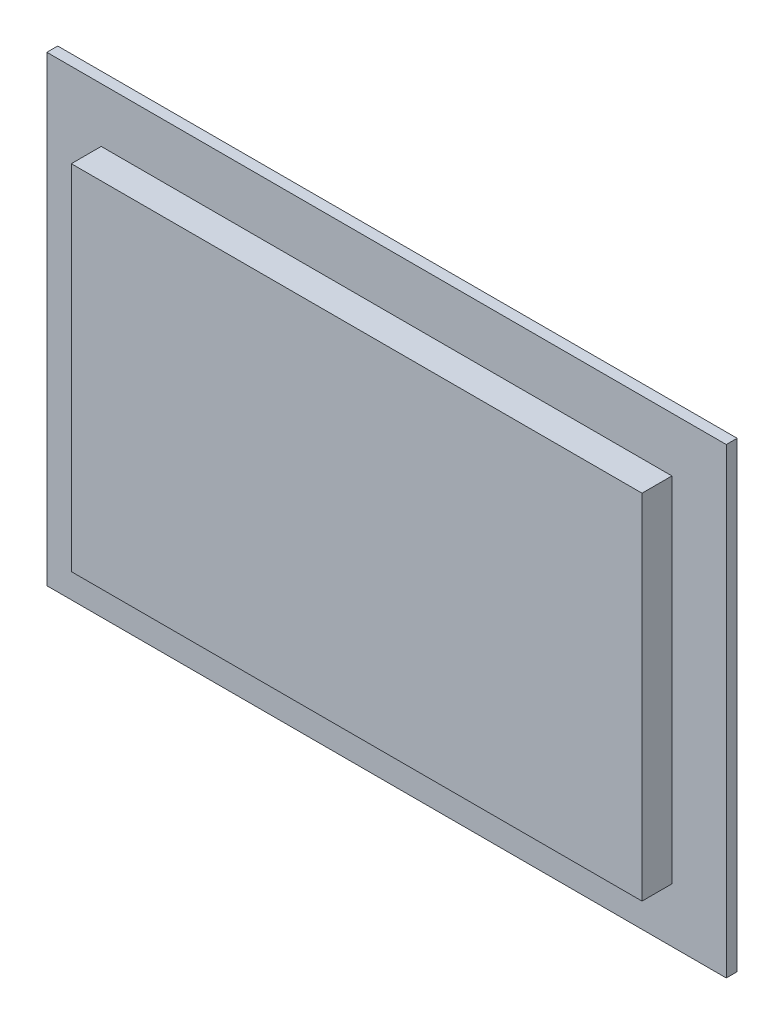
ISO-10303-21;
HEADER;
FILE_DESCRIPTION(('STEP AP214'),'2;1');
FILE_NAME('part.step','',(''),(''),'','','');
FILE_SCHEMA(('AUTOMOTIVE_DESIGN { 1 0 10303 214 1 1 1 1 }'));
ENDSEC;
DATA;
#1=APPLICATION_CONTEXT('core data for automotive mechanical design processes');
#2=APPLICATION_PROTOCOL_DEFINITION('international standard','automotive_design',2000,#1);
#3=PRODUCT_CONTEXT('',#1,'mechanical');
#4=PRODUCT('Part','Part','',(#3));
#5=PRODUCT_RELATED_PRODUCT_CATEGORY('part','',(#4));
#6=PRODUCT_DEFINITION_FORMATION('','',#4);
#7=PRODUCT_DEFINITION_CONTEXT('part definition',#1,'design');
#8=PRODUCT_DEFINITION('design','',#6,#7);
#9=PRODUCT_DEFINITION_SHAPE('','',#8);
#10=(LENGTH_UNIT() NAMED_UNIT(*) SI_UNIT(.MILLI.,.METRE.));
#11=(NAMED_UNIT(*) PLANE_ANGLE_UNIT() SI_UNIT($,.RADIAN.));
#12=(NAMED_UNIT(*) SI_UNIT($,.STERADIAN.) SOLID_ANGLE_UNIT());
#13=UNCERTAINTY_MEASURE_WITH_UNIT(LENGTH_MEASURE(1.E-05),#10,'distance_accuracy_value','');
#14=(GEOMETRIC_REPRESENTATION_CONTEXT(3) GLOBAL_UNCERTAINTY_ASSIGNED_CONTEXT((#13)) GLOBAL_UNIT_ASSIGNED_CONTEXT((#10,
#11,#12)) REPRESENTATION_CONTEXT('',''));
#15=CARTESIAN_POINT('',(0.,0.,0.));
#16=DIRECTION('',(0.,0.,1.));
#17=DIRECTION('',(1.,0.,0.));
#18=AXIS2_PLACEMENT_3D('',#15,#16,#17);
#19=CARTESIAN_POINT('',(0.,0.,2.));
#20=DIRECTION('',(0.,0.,1.));
#21=DIRECTION('',(1.,0.,0.));
#22=AXIS2_PLACEMENT_3D('',#19,#20,#21);
#23=PLANE('',#22);
#24=DIRECTION('',(0.,-1.,0.));
#25=VECTOR('',#24,1.);
#26=CARTESIAN_POINT('',(62.5,0.,2.));
#27=LINE('',#26,#25);
#28=CARTESIAN_POINT('',(62.5,42.5,2.));
#29=VERTEX_POINT('',#28);
#30=CARTESIAN_POINT('',(62.5,-42.5,2.));
#31=VERTEX_POINT('',#30);
#32=EDGE_CURVE('E11',#29,#31,#27,.T.);
#33=ORIENTED_EDGE('',*,*,#32,.F.);
#34=DIRECTION('',(-1.,0.,0.));
#35=VECTOR('',#34,1.);
#36=CARTESIAN_POINT('',(0.,42.5,2.));
#37=LINE('',#36,#35);
#38=CARTESIAN_POINT('',(-62.5,42.5,2.));
#39=VERTEX_POINT('',#38);
#40=EDGE_CURVE('E24',#29,#39,#37,.T.);
#41=ORIENTED_EDGE('',*,*,#40,.T.);
#42=DIRECTION('',(0.,-1.,0.));
#43=VECTOR('',#42,1.);
#44=CARTESIAN_POINT('',(-62.5,0.,2.));
#45=LINE('',#44,#43);
#46=CARTESIAN_POINT('',(-62.5,-42.5,2.));
#47=VERTEX_POINT('',#46);
#48=EDGE_CURVE('E144',#39,#47,#45,.T.);
#49=ORIENTED_EDGE('',*,*,#48,.T.);
#50=DIRECTION('',(-1.,0.,0.));
#51=VECTOR('',#50,1.);
#52=CARTESIAN_POINT('',(0.,-42.5,2.));
#53=LINE('',#52,#51);
#54=EDGE_CURVE('E141',#31,#47,#53,.T.);
#55=ORIENTED_EDGE('',*,*,#54,.F.);
#56=EDGE_LOOP('',(#33,#41,#49,#55));
#57=FACE_BOUND('',#56,.T.);
#58=DIRECTION('',(-1.,0.,0.));
#59=VECTOR('',#58,1.);
#60=CARTESIAN_POINT('',(0.,32.5,2.));
#61=LINE('',#60,#59);
#62=CARTESIAN_POINT('',(52.5,32.5,2.));
#63=VERTEX_POINT('',#62);
#64=CARTESIAN_POINT('',(-52.5,32.5,2.));
#65=VERTEX_POINT('',#64);
#66=EDGE_CURVE('E138',#63,#65,#61,.T.);
#67=ORIENTED_EDGE('',*,*,#66,.F.);
#68=DIRECTION('',(0.,-1.,0.));
#69=VECTOR('',#68,1.);
#70=CARTESIAN_POINT('',(52.5,0.,2.));
#71=LINE('',#70,#69);
#72=CARTESIAN_POINT('',(52.5,-32.5,2.));
#73=VERTEX_POINT('',#72);
#74=EDGE_CURVE('E136',#63,#73,#71,.T.);
#75=ORIENTED_EDGE('',*,*,#74,.T.);
#76=DIRECTION('',(-1.,0.,0.));
#77=VECTOR('',#76,1.);
#78=CARTESIAN_POINT('',(0.,-32.5,2.));
#79=LINE('',#78,#77);
#80=CARTESIAN_POINT('',(-52.5,-32.5,2.));
#81=VERTEX_POINT('',#80);
#82=EDGE_CURVE('E134',#73,#81,#79,.T.);
#83=ORIENTED_EDGE('',*,*,#82,.T.);
#84=DIRECTION('',(0.,-1.,0.));
#85=VECTOR('',#84,1.);
#86=CARTESIAN_POINT('',(-52.5,0.,2.));
#87=LINE('',#86,#85);
#88=EDGE_CURVE('E85',#65,#81,#87,.T.);
#89=ORIENTED_EDGE('',*,*,#88,.F.);
#90=EDGE_LOOP('',(#67,#75,#83,#89));
#91=FACE_BOUND('',#90,.T.);
#92=ADVANCED_FACE('F17',(#57,#91),#23,.T.);
#93=CARTESIAN_POINT('',(62.5,0.,2.));
#94=DIRECTION('',(1.,0.,0.));
#95=DIRECTION('',(0.,1.,0.));
#96=AXIS2_PLACEMENT_3D('',#93,#94,#95);
#97=PLANE('',#96);
#98=DIRECTION('',(0.,-1.,0.));
#99=VECTOR('',#98,1.);
#100=CARTESIAN_POINT('',(62.5,0.,0.));
#101=LINE('',#100,#99);
#102=CARTESIAN_POINT('',(62.5,42.5,0.));
#103=VERTEX_POINT('',#102);
#104=CARTESIAN_POINT('',(62.5,-42.5,0.));
#105=VERTEX_POINT('',#104);
#106=EDGE_CURVE('E130',#103,#105,#101,.T.);
#107=ORIENTED_EDGE('',*,*,#106,.F.);
#108=DIRECTION('',(0.,0.,-1.));
#109=VECTOR('',#108,1.);
#110=CARTESIAN_POINT('',(62.5,42.5,2.));
#111=LINE('',#110,#109);
#112=EDGE_CURVE('E127',#29,#103,#111,.T.);
#113=ORIENTED_EDGE('',*,*,#112,.F.);
#114=ORIENTED_EDGE('',*,*,#32,.T.);
#115=DIRECTION('',(0.,0.,-1.));
#116=VECTOR('',#115,1.);
#117=CARTESIAN_POINT('',(62.5,-42.5,2.));
#118=LINE('',#117,#116);
#119=EDGE_CURVE('E125',#31,#105,#118,.T.);
#120=ORIENTED_EDGE('',*,*,#119,.T.);
#121=EDGE_LOOP('',(#107,#113,#114,#120));
#122=FACE_BOUND('',#121,.T.);
#123=ADVANCED_FACE('F156',(#122),#97,.T.);
#124=CARTESIAN_POINT('',(0.,42.5,2.));
#125=DIRECTION('',(0.,-1.,0.));
#126=DIRECTION('',(0.,0.,-1.));
#127=AXIS2_PLACEMENT_3D('',#124,#125,#126);
#128=PLANE('',#127);
#129=DIRECTION('',(-1.,0.,0.));
#130=VECTOR('',#129,1.);
#131=CARTESIAN_POINT('',(0.,42.5,0.));
#132=LINE('',#131,#130);
#133=CARTESIAN_POINT('',(-62.5,42.5,0.));
#134=VERTEX_POINT('',#133);
#135=EDGE_CURVE('E123',#103,#134,#132,.T.);
#136=ORIENTED_EDGE('',*,*,#135,.T.);
#137=DIRECTION('',(0.,0.,-1.));
#138=VECTOR('',#137,1.);
#139=CARTESIAN_POINT('',(-62.5,42.5,2.));
#140=LINE('',#139,#138);
#141=EDGE_CURVE('E120',#39,#134,#140,.T.);
#142=ORIENTED_EDGE('',*,*,#141,.F.);
#143=ORIENTED_EDGE('',*,*,#40,.F.);
#144=ORIENTED_EDGE('',*,*,#112,.T.);
#145=EDGE_LOOP('',(#136,#142,#143,#144));
#146=FACE_BOUND('',#145,.T.);
#147=ADVANCED_FACE('F159',(#146),#128,.F.);
#148=CARTESIAN_POINT('',(-62.5,0.,2.));
#149=DIRECTION('',(1.,0.,0.));
#150=DIRECTION('',(0.,1.,0.));
#151=AXIS2_PLACEMENT_3D('',#148,#149,#150);
#152=PLANE('',#151);
#153=DIRECTION('',(0.,-1.,0.));
#154=VECTOR('',#153,1.);
#155=CARTESIAN_POINT('',(-62.5,0.,0.));
#156=LINE('',#155,#154);
#157=CARTESIAN_POINT('',(-62.5,-42.5,0.));
#158=VERTEX_POINT('',#157);
#159=EDGE_CURVE('E118',#134,#158,#156,.T.);
#160=ORIENTED_EDGE('',*,*,#159,.T.);
#161=DIRECTION('',(0.,0.,-1.));
#162=VECTOR('',#161,1.);
#163=CARTESIAN_POINT('',(-62.5,-42.5,2.));
#164=LINE('',#163,#162);
#165=EDGE_CURVE('E115',#47,#158,#164,.T.);
#166=ORIENTED_EDGE('',*,*,#165,.F.);
#167=ORIENTED_EDGE('',*,*,#48,.F.);
#168=ORIENTED_EDGE('',*,*,#141,.T.);
#169=EDGE_LOOP('',(#160,#166,#167,#168));
#170=FACE_BOUND('',#169,.T.);
#171=ADVANCED_FACE('F149',(#170),#152,.F.);
#172=CARTESIAN_POINT('',(0.,-42.5,2.));
#173=DIRECTION('',(0.,-1.,0.));
#174=DIRECTION('',(0.,0.,-1.));
#175=AXIS2_PLACEMENT_3D('',#172,#173,#174);
#176=PLANE('',#175);
#177=DIRECTION('',(-1.,0.,0.));
#178=VECTOR('',#177,1.);
#179=CARTESIAN_POINT('',(0.,-42.5,0.));
#180=LINE('',#179,#178);
#181=EDGE_CURVE('E112',#105,#158,#180,.T.);
#182=ORIENTED_EDGE('',*,*,#181,.F.);
#183=ORIENTED_EDGE('',*,*,#119,.F.);
#184=ORIENTED_EDGE('',*,*,#54,.T.);
#185=ORIENTED_EDGE('',*,*,#165,.T.);
#186=EDGE_LOOP('',(#182,#183,#184,#185));
#187=FACE_BOUND('',#186,.T.);
#188=ADVANCED_FACE('F154',(#187),#176,.T.);
#189=CARTESIAN_POINT('',(0.,0.,0.));
#190=DIRECTION('',(0.,0.,1.));
#191=DIRECTION('',(1.,0.,0.));
#192=AXIS2_PLACEMENT_3D('',#189,#190,#191);
#193=PLANE('',#192);
#194=ORIENTED_EDGE('',*,*,#106,.T.);
#195=ORIENTED_EDGE('',*,*,#181,.T.);
#196=ORIENTED_EDGE('',*,*,#159,.F.);
#197=ORIENTED_EDGE('',*,*,#135,.F.);
#198=EDGE_LOOP('',(#194,#195,#196,#197));
#199=FACE_BOUND('',#198,.T.);
#200=ADVANCED_FACE('F161',(#199),#193,.F.);
#201=CARTESIAN_POINT('',(52.5,0.,7.5));
#202=DIRECTION('',(1.,0.,0.));
#203=DIRECTION('',(0.,1.,0.));
#204=AXIS2_PLACEMENT_3D('',#201,#202,#203);
#205=PLANE('',#204);
#206=ORIENTED_EDGE('',*,*,#74,.F.);
#207=DIRECTION('',(0.,0.,-1.));
#208=VECTOR('',#207,1.);
#209=CARTESIAN_POINT('',(52.5,32.5,7.5));
#210=LINE('',#209,#208);
#211=CARTESIAN_POINT('',(52.5,32.5,7.5));
#212=VERTEX_POINT('',#211);
#213=EDGE_CURVE('E109',#212,#63,#210,.T.);
#214=ORIENTED_EDGE('',*,*,#213,.F.);
#215=DIRECTION('',(0.,-1.,0.));
#216=VECTOR('',#215,1.);
#217=CARTESIAN_POINT('',(52.5,0.,7.5));
#218=LINE('',#217,#216);
#219=CARTESIAN_POINT('',(52.5,-32.5,7.5));
#220=VERTEX_POINT('',#219);
#221=EDGE_CURVE('E107',#212,#220,#218,.T.);
#222=ORIENTED_EDGE('',*,*,#221,.T.);
#223=DIRECTION('',(0.,0.,-1.));
#224=VECTOR('',#223,1.);
#225=CARTESIAN_POINT('',(52.5,-32.5,7.5));
#226=LINE('',#225,#224);
#227=EDGE_CURVE('E95',#220,#73,#226,.T.);
#228=ORIENTED_EDGE('',*,*,#227,.T.);
#229=EDGE_LOOP('',(#206,#214,#222,#228));
#230=FACE_BOUND('',#229,.T.);
#231=ADVANCED_FACE('F163',(#230),#205,.T.);
#232=CARTESIAN_POINT('',(0.,32.5,7.5));
#233=DIRECTION('',(0.,-1.,0.));
#234=DIRECTION('',(1.,0.,0.));
#235=AXIS2_PLACEMENT_3D('',#232,#233,#234);
#236=PLANE('',#235);
#237=ORIENTED_EDGE('',*,*,#66,.T.);
#238=DIRECTION('',(0.,0.,-1.));
#239=VECTOR('',#238,1.);
#240=CARTESIAN_POINT('',(-52.5,32.5,7.5));
#241=LINE('',#240,#239);
#242=CARTESIAN_POINT('',(-52.5,32.5,7.5));
#243=VERTEX_POINT('',#242);
#244=EDGE_CURVE('E104',#243,#65,#241,.T.);
#245=ORIENTED_EDGE('',*,*,#244,.F.);
#246=DIRECTION('',(-1.,0.,0.));
#247=VECTOR('',#246,1.);
#248=CARTESIAN_POINT('',(0.,32.5,7.5));
#249=LINE('',#248,#247);
#250=EDGE_CURVE('E88',#212,#243,#249,.T.);
#251=ORIENTED_EDGE('',*,*,#250,.F.);
#252=ORIENTED_EDGE('',*,*,#213,.T.);
#253=EDGE_LOOP('',(#237,#245,#251,#252));
#254=FACE_BOUND('',#253,.T.);
#255=ADVANCED_FACE('F170',(#254),#236,.F.);
#256=CARTESIAN_POINT('',(-52.5,0.,7.5));
#257=DIRECTION('',(1.,0.,0.));
#258=DIRECTION('',(0.,1.,0.));
#259=AXIS2_PLACEMENT_3D('',#256,#257,#258);
#260=PLANE('',#259);
#261=ORIENTED_EDGE('',*,*,#88,.T.);
#262=DIRECTION('',(0.,0.,-1.));
#263=VECTOR('',#262,1.);
#264=CARTESIAN_POINT('',(-52.5,-32.5,7.5));
#265=LINE('',#264,#263);
#266=CARTESIAN_POINT('',(-52.5,-32.5,7.5));
#267=VERTEX_POINT('',#266);
#268=EDGE_CURVE('E78',#267,#81,#265,.T.);
#269=ORIENTED_EDGE('',*,*,#268,.F.);
#270=DIRECTION('',(0.,-1.,0.));
#271=VECTOR('',#270,1.);
#272=CARTESIAN_POINT('',(-52.5,0.,7.5));
#273=LINE('',#272,#271);
#274=EDGE_CURVE('E83',#243,#267,#273,.T.);
#275=ORIENTED_EDGE('',*,*,#274,.F.);
#276=ORIENTED_EDGE('',*,*,#244,.T.);
#277=EDGE_LOOP('',(#261,#269,#275,#276));
#278=FACE_BOUND('',#277,.T.);
#279=ADVANCED_FACE('F80',(#278),#260,.F.);
#280=CARTESIAN_POINT('',(0.,-32.5,7.5));
#281=DIRECTION('',(0.,-1.,0.));
#282=DIRECTION('',(1.,0.,0.));
#283=AXIS2_PLACEMENT_3D('',#280,#281,#282);
#284=PLANE('',#283);
#285=ORIENTED_EDGE('',*,*,#82,.F.);
#286=ORIENTED_EDGE('',*,*,#227,.F.);
#287=DIRECTION('',(-1.,0.,0.));
#288=VECTOR('',#287,1.);
#289=CARTESIAN_POINT('',(0.,-32.5,7.5));
#290=LINE('',#289,#288);
#291=EDGE_CURVE('E92',#220,#267,#290,.T.);
#292=ORIENTED_EDGE('',*,*,#291,.T.);
#293=ORIENTED_EDGE('',*,*,#268,.T.);
#294=EDGE_LOOP('',(#285,#286,#292,#293));
#295=FACE_BOUND('',#294,.T.);
#296=ADVANCED_FACE('F93',(#295),#284,.T.);
#297=CARTESIAN_POINT('',(0.,0.,7.5));
#298=DIRECTION('',(0.,0.,1.));
#299=DIRECTION('',(1.,0.,0.));
#300=AXIS2_PLACEMENT_3D('',#297,#298,#299);
#301=PLANE('',#300);
#302=ORIENTED_EDGE('',*,*,#221,.F.);
#303=ORIENTED_EDGE('',*,*,#250,.T.);
#304=ORIENTED_EDGE('',*,*,#274,.T.);
#305=ORIENTED_EDGE('',*,*,#291,.F.);
#306=EDGE_LOOP('',(#302,#303,#304,#305));
#307=FACE_BOUND('',#306,.T.);
#308=ADVANCED_FACE('F99',(#307),#301,.T.);
#309=CLOSED_SHELL('',(#92,#123,#147,#171,#188,#200,#231,#255,#279,#296,#308));
#310=MANIFOLD_SOLID_BREP('B1',#309);
#311=ADVANCED_BREP_SHAPE_REPRESENTATION('',(#18,#310),#14);
#312=SHAPE_DEFINITION_REPRESENTATION(#9,#311);
ENDSEC;
END-ISO-10303-21;
